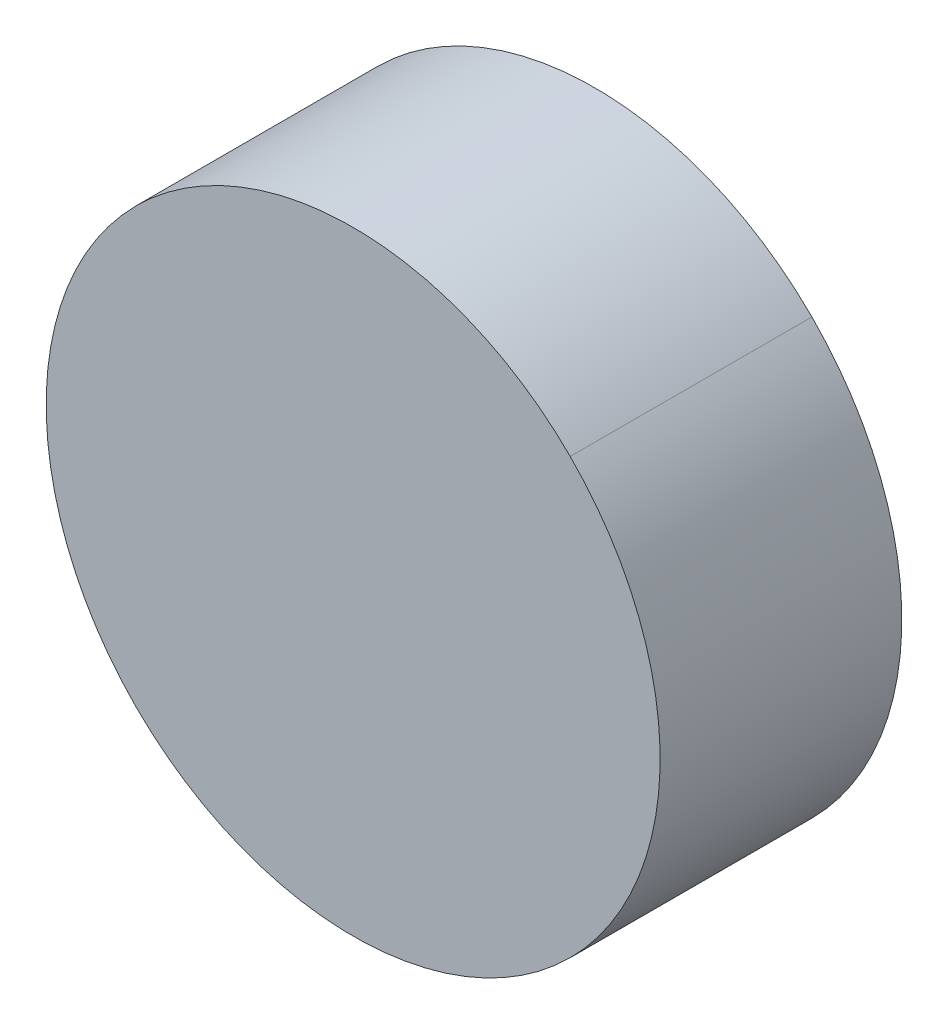
ISO-10303-21;
HEADER;
FILE_DESCRIPTION(('STEP AP214'),'2;1');
FILE_NAME('part.step','',(''),(''),'','','');
FILE_SCHEMA(('AUTOMOTIVE_DESIGN { 1 0 10303 214 1 1 1 1 }'));
ENDSEC;
DATA;
#1=APPLICATION_CONTEXT('core data for automotive mechanical design processes');
#2=APPLICATION_PROTOCOL_DEFINITION('international standard','automotive_design',2000,#1);
#3=PRODUCT_CONTEXT('',#1,'mechanical');
#4=PRODUCT('Part','Part','',(#3));
#5=PRODUCT_RELATED_PRODUCT_CATEGORY('part','',(#4));
#6=PRODUCT_DEFINITION_FORMATION('','',#4);
#7=PRODUCT_DEFINITION_CONTEXT('part definition',#1,'design');
#8=PRODUCT_DEFINITION('design','',#6,#7);
#9=PRODUCT_DEFINITION_SHAPE('','',#8);
#10=(LENGTH_UNIT() NAMED_UNIT(*) SI_UNIT(.MILLI.,.METRE.));
#11=(NAMED_UNIT(*) PLANE_ANGLE_UNIT() SI_UNIT($,.RADIAN.));
#12=(NAMED_UNIT(*) SI_UNIT($,.STERADIAN.) SOLID_ANGLE_UNIT());
#13=UNCERTAINTY_MEASURE_WITH_UNIT(LENGTH_MEASURE(1.E-05),#10,'distance_accuracy_value','');
#14=(GEOMETRIC_REPRESENTATION_CONTEXT(3) GLOBAL_UNCERTAINTY_ASSIGNED_CONTEXT((#13)) GLOBAL_UNIT_ASSIGNED_CONTEXT((#10,
#11,#12)) REPRESENTATION_CONTEXT('',''));
#15=CARTESIAN_POINT('',(0.,0.,0.));
#16=DIRECTION('',(0.,0.,1.));
#17=DIRECTION('',(1.,0.,0.));
#18=AXIS2_PLACEMENT_3D('',#15,#16,#17);
#19=CARTESIAN_POINT('',(92.62101872,53.85390042,0.));
#20=DIRECTION('',(0.707106781351387,0.707106781021708,0.));
#21=DIRECTION('',(0.707106781021708,-0.707106781351387,0.));
#22=AXIS2_PLACEMENT_3D('',#19,#20,#21);
#23=PLANE('',#22);
#24=DIRECTION('',(0.707106781021708,-0.707106781351387,0.));
#25=VECTOR('',#24,1.);
#26=CARTESIAN_POINT('',(92.62101872,53.85390042,0.1999996));
#27=LINE('',#26,#25);
#28=CARTESIAN_POINT('',(92.62101872,53.85390042,0.1999996));
#29=VERTEX_POINT('',#28);
#30=CARTESIAN_POINT('',(92.62103396,53.85388518,0.1999996));
#31=VERTEX_POINT('',#30);
#32=EDGE_CURVE('E11',#29,#31,#27,.T.);
#33=ORIENTED_EDGE('',*,*,#32,.F.);
#34=DIRECTION('',(0.,0.,1.));
#35=VECTOR('',#34,1.);
#36=CARTESIAN_POINT('',(92.62101872,53.85390042,0.));
#37=LINE('',#36,#35);
#38=CARTESIAN_POINT('',(92.62101872,53.85390042,0.));
#39=VERTEX_POINT('',#38);
#40=EDGE_CURVE('E24',#39,#29,#37,.T.);
#41=ORIENTED_EDGE('',*,*,#40,.F.);
#42=DIRECTION('',(0.707106781021708,-0.707106781351387,0.));
#43=VECTOR('',#42,1.);
#44=CARTESIAN_POINT('',(92.62101872,53.85390042,0.));
#45=LINE('',#44,#43);
#46=CARTESIAN_POINT('',(92.62103396,53.85388518,0.));
#47=VERTEX_POINT('',#46);
#48=EDGE_CURVE('E75',#39,#47,#45,.T.);
#49=ORIENTED_EDGE('',*,*,#48,.T.);
#50=DIRECTION('',(0.,0.,1.));
#51=VECTOR('',#50,1.);
#52=CARTESIAN_POINT('',(92.62103396,53.85388518,0.));
#53=LINE('',#52,#51);
#54=EDGE_CURVE('E37',#47,#31,#53,.T.);
#55=ORIENTED_EDGE('',*,*,#54,.T.);
#56=EDGE_LOOP('',(#33,#41,#49,#55));
#57=FACE_BOUND('',#56,.T.);
#58=ADVANCED_FACE('F17',(#57),#23,.F.);
#59=CARTESIAN_POINT('',(92.80063863,54.03349112,0.));
#60=DIRECTION('',(0.,0.,-1.));
#61=DIRECTION('',(-0.707104281184673,-0.707109281179584,0.));
#62=AXIS2_PLACEMENT_3D('',#59,#60,#61);
#63=CYLINDRICAL_SURFACE('',#62,0.254000258206749);
#64=CARTESIAN_POINT('',(92.80063863,54.03349112,0.1999996));
#65=DIRECTION('',(0.,0.,1.));
#66=DIRECTION('',(-0.707104281184673,-0.707109281179584,0.));
#67=AXIS2_PLACEMENT_3D('',#64,#65,#66);
#68=CIRCLE('',#67,0.254000258206749);
#69=CARTESIAN_POINT('',(92.9802433,54.21309706,0.1999996));
#70=VERTEX_POINT('',#69);
#71=EDGE_CURVE('E83',#31,#70,#68,.T.);
#72=ORIENTED_EDGE('',*,*,#71,.F.);
#73=ORIENTED_EDGE('',*,*,#54,.F.);
#74=CARTESIAN_POINT('',(92.80063863,54.03349112,0.));
#75=DIRECTION('',(0.,0.,1.));
#76=DIRECTION('',(-0.707104281184673,-0.707109281179584,0.));
#77=AXIS2_PLACEMENT_3D('',#74,#75,#76);
#78=CIRCLE('',#77,0.254000258206749);
#79=CARTESIAN_POINT('',(92.9802433,54.21309706,0.));
#80=VERTEX_POINT('',#79);
#81=EDGE_CURVE('E81',#47,#80,#78,.T.);
#82=ORIENTED_EDGE('',*,*,#81,.T.);
#83=DIRECTION('',(0.,0.,1.));
#84=VECTOR('',#83,1.);
#85=CARTESIAN_POINT('',(92.9802433,54.21309706,0.));
#86=LINE('',#85,#84);
#87=EDGE_CURVE('E67',#80,#70,#86,.T.);
#88=ORIENTED_EDGE('',*,*,#87,.T.);
#89=EDGE_LOOP('',(#72,#73,#82,#88));
#90=FACE_BOUND('',#89,.T.);
#91=ADVANCED_FACE('F89',(#90),#63,.T.);
#92=CARTESIAN_POINT('',(92.9802433,54.21309706,0.));
#93=DIRECTION('',(-0.707106780988741,-0.707106781384355,0.));
#94=DIRECTION('',(-0.707106781384355,0.707106780988741,0.));
#95=AXIS2_PLACEMENT_3D('',#92,#93,#94);
#96=PLANE('',#95);
#97=DIRECTION('',(-0.707106781384355,0.707106780988741,0.));
#98=VECTOR('',#97,1.);
#99=CARTESIAN_POINT('',(92.9802433,54.21309706,0.1999996));
#100=LINE('',#99,#98);
#101=CARTESIAN_POINT('',(92.9802306,54.21310976,0.1999996));
#102=VERTEX_POINT('',#101);
#103=EDGE_CURVE('E71',#70,#102,#100,.T.);
#104=ORIENTED_EDGE('',*,*,#103,.F.);
#105=ORIENTED_EDGE('',*,*,#87,.F.);
#106=DIRECTION('',(-0.707106781384355,0.707106780988741,0.));
#107=VECTOR('',#106,1.);
#108=CARTESIAN_POINT('',(92.9802433,54.21309706,0.));
#109=LINE('',#108,#107);
#110=CARTESIAN_POINT('',(92.9802306,54.21310976,0.));
#111=VERTEX_POINT('',#110);
#112=EDGE_CURVE('E63',#80,#111,#109,.T.);
#113=ORIENTED_EDGE('',*,*,#112,.T.);
#114=DIRECTION('',(0.,0.,1.));
#115=VECTOR('',#114,1.);
#116=CARTESIAN_POINT('',(92.9802306,54.21310976,0.));
#117=LINE('',#116,#115);
#118=EDGE_CURVE('E53',#111,#102,#117,.T.);
#119=ORIENTED_EDGE('',*,*,#118,.T.);
#120=EDGE_LOOP('',(#104,#105,#113,#119));
#121=FACE_BOUND('',#120,.T.);
#122=ADVANCED_FACE('F66',(#121),#96,.F.);
#123=CARTESIAN_POINT('',(92.80062466,54.03350509,0.));
#124=DIRECTION('',(0.,0.,-1.));
#125=DIRECTION('',(0.707109281179584,0.707104281184673,0.));
#126=AXIS2_PLACEMENT_3D('',#123,#124,#125);
#127=CYLINDRICAL_SURFACE('',#126,0.254000258206746);
#128=CARTESIAN_POINT('',(92.80062466,54.03350509,0.1999996));
#129=DIRECTION('',(0.,0.,1.));
#130=DIRECTION('',(0.707109281179584,0.707104281184673,0.));
#131=AXIS2_PLACEMENT_3D('',#128,#129,#130);
#132=CIRCLE('',#131,0.254000258206746);
#133=EDGE_CURVE('E59',#102,#29,#132,.T.);
#134=ORIENTED_EDGE('',*,*,#133,.F.);
#135=ORIENTED_EDGE('',*,*,#118,.F.);
#136=CARTESIAN_POINT('',(92.80062466,54.03350509,0.));
#137=DIRECTION('',(0.,0.,1.));
#138=DIRECTION('',(0.707109281179584,0.707104281184673,0.));
#139=AXIS2_PLACEMENT_3D('',#136,#137,#138);
#140=CIRCLE('',#139,0.254000258206746);
#141=EDGE_CURVE('E57',#111,#39,#140,.T.);
#142=ORIENTED_EDGE('',*,*,#141,.T.);
#143=ORIENTED_EDGE('',*,*,#40,.T.);
#144=EDGE_LOOP('',(#134,#135,#142,#143));
#145=FACE_BOUND('',#144,.T.);
#146=ADVANCED_FACE('F55',(#145),#127,.T.);
#147=CARTESIAN_POINT('',(92.62101872,53.85390042,0.));
#148=DIRECTION('',(0.,0.,-1.));
#149=DIRECTION('',(-1.,0.,0.));
#150=AXIS2_PLACEMENT_3D('',#147,#148,#149);
#151=PLANE('',#150);
#152=ORIENTED_EDGE('',*,*,#141,.F.);
#153=ORIENTED_EDGE('',*,*,#112,.F.);
#154=ORIENTED_EDGE('',*,*,#81,.F.);
#155=ORIENTED_EDGE('',*,*,#48,.F.);
#156=EDGE_LOOP('',(#152,#153,#154,#155));
#157=FACE_BOUND('',#156,.T.);
#158=ADVANCED_FACE('F74',(#157),#151,.T.);
#159=CARTESIAN_POINT('',(92.62101872,53.85390042,0.1999996));
#160=DIRECTION('',(0.,0.,-1.));
#161=DIRECTION('',(-1.,0.,0.));
#162=AXIS2_PLACEMENT_3D('',#159,#160,#161);
#163=PLANE('',#162);
#164=ORIENTED_EDGE('',*,*,#32,.T.);
#165=ORIENTED_EDGE('',*,*,#71,.T.);
#166=ORIENTED_EDGE('',*,*,#103,.T.);
#167=ORIENTED_EDGE('',*,*,#133,.T.);
#168=EDGE_LOOP('',(#164,#165,#166,#167));
#169=FACE_BOUND('',#168,.T.);
#170=ADVANCED_FACE('F91',(#169),#163,.F.);
#171=CLOSED_SHELL('',(#58,#91,#122,#146,#158,#170));
#172=MANIFOLD_SOLID_BREP('B1',#171);
#173=ADVANCED_BREP_SHAPE_REPRESENTATION('',(#18,#172),#14);
#174=SHAPE_DEFINITION_REPRESENTATION(#9,#173);
ENDSEC;
END-ISO-10303-21;
